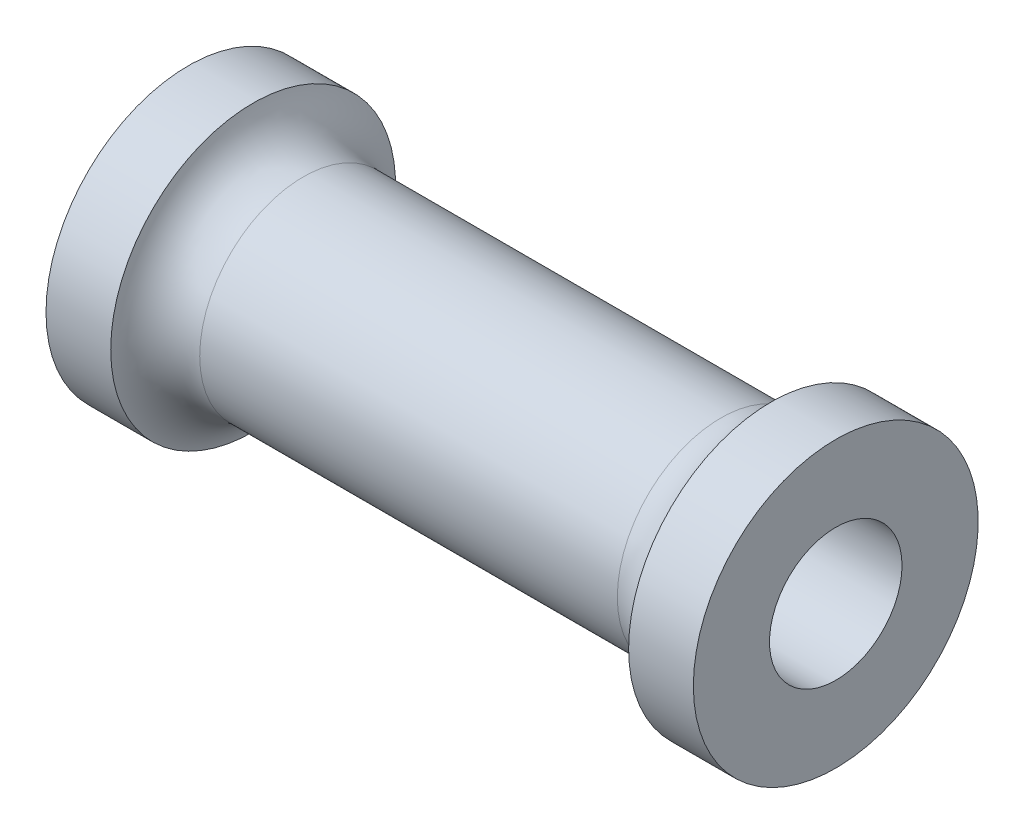
ISO-10303-21;
HEADER;
FILE_DESCRIPTION(('STEP AP214'),'2;1');
FILE_NAME('part.step','',(''),(''),'','','');
FILE_SCHEMA(('AUTOMOTIVE_DESIGN { 1 0 10303 214 1 1 1 1 }'));
ENDSEC;
DATA;
#1=APPLICATION_CONTEXT('core data for automotive mechanical design processes');
#2=APPLICATION_PROTOCOL_DEFINITION('international standard','automotive_design',2000,#1);
#3=PRODUCT_CONTEXT('',#1,'mechanical');
#4=PRODUCT('Part','Part','',(#3));
#5=PRODUCT_RELATED_PRODUCT_CATEGORY('part','',(#4));
#6=PRODUCT_DEFINITION_FORMATION('','',#4);
#7=PRODUCT_DEFINITION_CONTEXT('part definition',#1,'design');
#8=PRODUCT_DEFINITION('design','',#6,#7);
#9=PRODUCT_DEFINITION_SHAPE('','',#8);
#10=(LENGTH_UNIT() NAMED_UNIT(*) SI_UNIT(.MILLI.,.METRE.));
#11=(NAMED_UNIT(*) PLANE_ANGLE_UNIT() SI_UNIT($,.RADIAN.));
#12=(NAMED_UNIT(*) SI_UNIT($,.STERADIAN.) SOLID_ANGLE_UNIT());
#13=UNCERTAINTY_MEASURE_WITH_UNIT(LENGTH_MEASURE(1.E-05),#10,'distance_accuracy_value','');
#14=(GEOMETRIC_REPRESENTATION_CONTEXT(3) GLOBAL_UNCERTAINTY_ASSIGNED_CONTEXT((#13)) GLOBAL_UNIT_ASSIGNED_CONTEXT((#10,
#11,#12)) REPRESENTATION_CONTEXT('',''));
#15=CARTESIAN_POINT('',(0.,0.,0.));
#16=DIRECTION('',(0.,0.,1.));
#17=DIRECTION('',(1.,0.,0.));
#18=AXIS2_PLACEMENT_3D('',#15,#16,#17);
#19=CARTESIAN_POINT('',(15.875,0.,0.));
#20=DIRECTION('',(-1.,0.,0.));
#21=DIRECTION('',(0.,0.,1.));
#22=AXIS2_PLACEMENT_3D('',#19,#20,#21);
#23=PLANE('',#22);
#24=CARTESIAN_POINT('',(15.875,0.,0.));
#25=DIRECTION('',(1.,0.,0.));
#26=DIRECTION('',(0.,0.,-1.));
#27=AXIS2_PLACEMENT_3D('',#24,#25,#26);
#28=CIRCLE('',#27,3.25);
#29=CARTESIAN_POINT('',(15.875,0.,-3.25));
#30=VERTEX_POINT('',#29);
#31=EDGE_CURVE('E61',#30,#30,#28,.T.);
#32=ORIENTED_EDGE('',*,*,#31,.F.);
#33=EDGE_LOOP('',(#32));
#34=FACE_BOUND('',#33,.T.);
#35=CARTESIAN_POINT('',(15.875,0.,0.));
#36=DIRECTION('',(-1.,0.,0.));
#37=DIRECTION('',(0.,0.,1.));
#38=AXIS2_PLACEMENT_3D('',#35,#36,#37);
#39=CIRCLE('',#38,6.985);
#40=CARTESIAN_POINT('',(15.875,0.,6.985));
#41=VERTEX_POINT('',#40);
#42=EDGE_CURVE('E45',#41,#41,#39,.T.);
#43=ORIENTED_EDGE('',*,*,#42,.F.);
#44=EDGE_LOOP('',(#43));
#45=FACE_BOUND('',#44,.T.);
#46=ADVANCED_FACE('F34',(#34,#45),#23,.F.);
#47=CARTESIAN_POINT('',(0.,0.,0.));
#48=DIRECTION('',(-1.,0.,0.));
#49=DIRECTION('',(0.,0.,1.));
#50=AXIS2_PLACEMENT_3D('',#47,#48,#49);
#51=CYLINDRICAL_SURFACE('',#50,6.985);
#52=CARTESIAN_POINT('',(12.7,0.,0.));
#53=DIRECTION('',(-1.,0.,0.));
#54=DIRECTION('',(0.,0.,1.));
#55=AXIS2_PLACEMENT_3D('',#52,#53,#54);
#56=CIRCLE('',#55,6.985);
#57=CARTESIAN_POINT('',(12.7,0.,6.985));
#58=VERTEX_POINT('',#57);
#59=EDGE_CURVE('E49',#58,#58,#56,.T.);
#60=ORIENTED_EDGE('',*,*,#59,.F.);
#61=EDGE_LOOP('',(#60));
#62=FACE_BOUND('',#61,.T.);
#63=ORIENTED_EDGE('',*,*,#42,.T.);
#64=EDGE_LOOP('',(#63));
#65=FACE_BOUND('',#64,.T.);
#66=ADVANCED_FACE('F78',(#62,#65),#51,.T.);
#67=CARTESIAN_POINT('',(0.,0.,0.));
#68=DIRECTION('',(-1.,0.,0.));
#69=DIRECTION('',(0.,0.,1.));
#70=AXIS2_PLACEMENT_3D('',#67,#68,#69);
#71=CYLINDRICAL_SURFACE('',#70,5.08);
#72=CARTESIAN_POINT('',(10.2406555751583,0.,0.));
#73=DIRECTION('',(1.,0.,0.));
#74=DIRECTION('',(0.,0.,-1.));
#75=AXIS2_PLACEMENT_3D('',#72,#73,#74);
#76=CIRCLE('',#75,5.08);
#77=CARTESIAN_POINT('',(10.2406555751583,0.,-5.08));
#78=VERTEX_POINT('',#77);
#79=EDGE_CURVE('E10',#78,#78,#76,.F.);
#80=ORIENTED_EDGE('',*,*,#79,.T.);
#81=EDGE_LOOP('',(#80));
#82=FACE_BOUND('',#81,.T.);
#83=CARTESIAN_POINT('',(-10.2406555751583,0.,0.));
#84=DIRECTION('',(-1.,0.,0.));
#85=DIRECTION('',(0.,0.,1.));
#86=AXIS2_PLACEMENT_3D('',#83,#84,#85);
#87=CIRCLE('',#86,5.08);
#88=CARTESIAN_POINT('',(-10.2406555751583,0.,5.08));
#89=VERTEX_POINT('',#88);
#90=EDGE_CURVE('E41',#89,#89,#87,.F.);
#91=ORIENTED_EDGE('',*,*,#90,.T.);
#92=EDGE_LOOP('',(#91));
#93=FACE_BOUND('',#92,.T.);
#94=ADVANCED_FACE('F83',(#82,#93),#71,.T.);
#95=CARTESIAN_POINT('',(-15.875,0.,0.));
#96=DIRECTION('',(1.,0.,0.));
#97=DIRECTION('',(0.,0.,1.));
#98=AXIS2_PLACEMENT_3D('',#95,#96,#97);
#99=PLANE('',#98);
#100=CARTESIAN_POINT('',(-15.875,0.,0.));
#101=DIRECTION('',(1.,0.,0.));
#102=DIRECTION('',(0.,0.,-1.));
#103=AXIS2_PLACEMENT_3D('',#100,#101,#102);
#104=CIRCLE('',#103,3.25);
#105=CARTESIAN_POINT('',(-15.875,0.,-3.25));
#106=VERTEX_POINT('',#105);
#107=EDGE_CURVE('E60',#106,#106,#104,.T.);
#108=ORIENTED_EDGE('',*,*,#107,.T.);
#109=EDGE_LOOP('',(#108));
#110=FACE_BOUND('',#109,.T.);
#111=CARTESIAN_POINT('',(-15.875,0.,0.));
#112=DIRECTION('',(-1.,0.,0.));
#113=DIRECTION('',(0.,0.,1.));
#114=AXIS2_PLACEMENT_3D('',#111,#112,#113);
#115=CIRCLE('',#114,6.985);
#116=CARTESIAN_POINT('',(-15.875,0.,6.985));
#117=VERTEX_POINT('',#116);
#118=EDGE_CURVE('E54',#117,#117,#115,.T.);
#119=ORIENTED_EDGE('',*,*,#118,.T.);
#120=EDGE_LOOP('',(#119));
#121=FACE_BOUND('',#120,.T.);
#122=ADVANCED_FACE('F67',(#110,#121),#99,.F.);
#123=CARTESIAN_POINT('',(0.,0.,0.));
#124=DIRECTION('',(1.,0.,0.));
#125=DIRECTION('',(0.,0.,1.));
#126=AXIS2_PLACEMENT_3D('',#123,#124,#125);
#127=CYLINDRICAL_SURFACE('',#126,6.985);
#128=CARTESIAN_POINT('',(-12.7,0.,0.));
#129=DIRECTION('',(-1.,0.,0.));
#130=DIRECTION('',(0.,0.,1.));
#131=AXIS2_PLACEMENT_3D('',#128,#129,#130);
#132=CIRCLE('',#131,6.985);
#133=CARTESIAN_POINT('',(-12.7,0.,6.985));
#134=VERTEX_POINT('',#133);
#135=EDGE_CURVE('E57',#134,#134,#132,.T.);
#136=ORIENTED_EDGE('',*,*,#135,.T.);
#137=EDGE_LOOP('',(#136));
#138=FACE_BOUND('',#137,.T.);
#139=ORIENTED_EDGE('',*,*,#118,.F.);
#140=EDGE_LOOP('',(#139));
#141=FACE_BOUND('',#140,.T.);
#142=ADVANCED_FACE('F94',(#138,#141),#127,.T.);
#143=CARTESIAN_POINT('',(10.2406555751583,0.,0.));
#144=DIRECTION('',(1.,0.,0.));
#145=DIRECTION('',(0.,0.,-1.));
#146=AXIS2_PLACEMENT_3D('',#143,#144,#145);
#147=TOROIDAL_SURFACE('',#146,7.62,2.54);
#148=ORIENTED_EDGE('',*,*,#59,.T.);
#149=EDGE_LOOP('',(#148));
#150=FACE_BOUND('',#149,.T.);
#151=ORIENTED_EDGE('',*,*,#79,.F.);
#152=EDGE_LOOP('',(#151));
#153=FACE_BOUND('',#152,.T.);
#154=ADVANCED_FACE('F92',(#150,#153),#147,.F.);
#155=CARTESIAN_POINT('',(-10.2406555751583,0.,0.));
#156=DIRECTION('',(-1.,0.,0.));
#157=DIRECTION('',(0.,0.,1.));
#158=AXIS2_PLACEMENT_3D('',#155,#156,#157);
#159=TOROIDAL_SURFACE('',#158,7.62,2.54);
#160=ORIENTED_EDGE('',*,*,#90,.F.);
#161=EDGE_LOOP('',(#160));
#162=FACE_BOUND('',#161,.T.);
#163=ORIENTED_EDGE('',*,*,#135,.F.);
#164=EDGE_LOOP('',(#163));
#165=FACE_BOUND('',#164,.T.);
#166=ADVANCED_FACE('F36',(#162,#165),#159,.F.);
#167=CARTESIAN_POINT('',(-15.875,0.,0.));
#168=DIRECTION('',(1.,0.,0.));
#169=DIRECTION('',(0.,0.,-1.));
#170=AXIS2_PLACEMENT_3D('',#167,#168,#169);
#171=CYLINDRICAL_SURFACE('',#170,3.25);
#172=ORIENTED_EDGE('',*,*,#107,.F.);
#173=EDGE_LOOP('',(#172));
#174=FACE_BOUND('',#173,.T.);
#175=ORIENTED_EDGE('',*,*,#31,.T.);
#176=EDGE_LOOP('',(#175));
#177=FACE_BOUND('',#176,.T.);
#178=ADVANCED_FACE('F70',(#174,#177),#171,.F.);
#179=CLOSED_SHELL('',(#46,#66,#94,#122,#142,#154,#166,#178));
#180=MANIFOLD_SOLID_BREP('B2',#179);
#181=ADVANCED_BREP_SHAPE_REPRESENTATION('',(#18,#180),#14);
#182=SHAPE_DEFINITION_REPRESENTATION(#9,#181);
ENDSEC;
END-ISO-10303-21;
